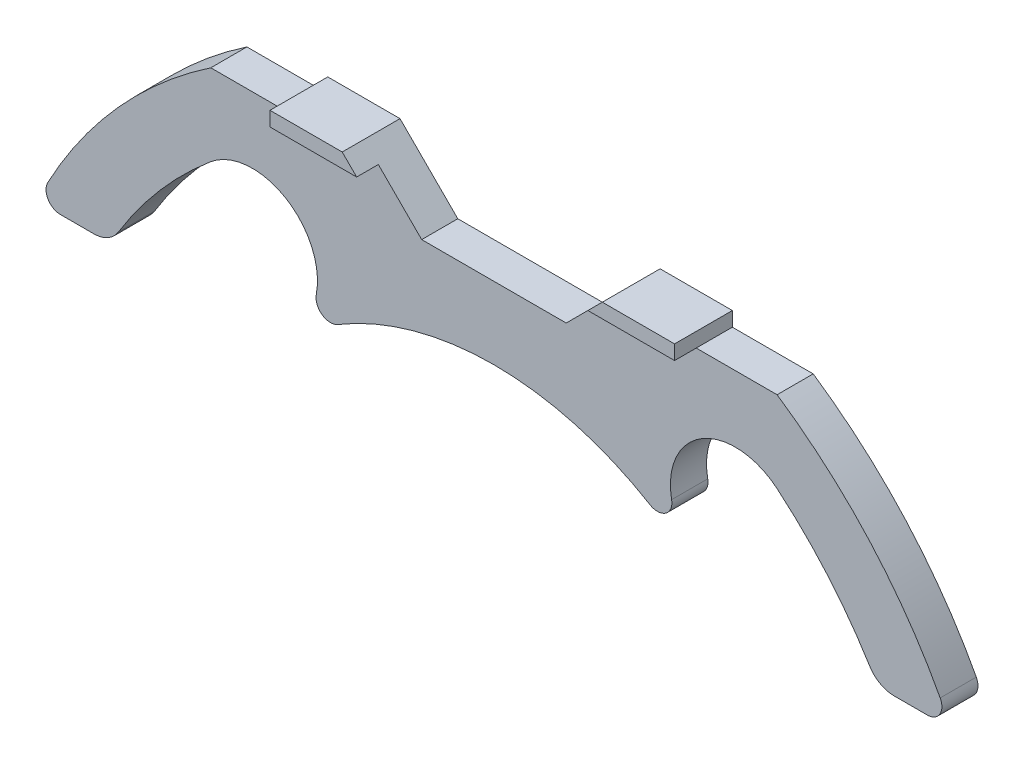
ISO-10303-21;
HEADER;
FILE_DESCRIPTION(('STEP AP214'),'2;1');
FILE_NAME('part.step','',(''),(''),'','','');
FILE_SCHEMA(('AUTOMOTIVE_DESIGN { 1 0 10303 214 1 1 1 1 }'));
ENDSEC;
DATA;
#1=APPLICATION_CONTEXT('core data for automotive mechanical design processes');
#2=APPLICATION_PROTOCOL_DEFINITION('international standard','automotive_design',2000,#1);
#3=PRODUCT_CONTEXT('',#1,'mechanical');
#4=PRODUCT('Part','Part','',(#3));
#5=PRODUCT_RELATED_PRODUCT_CATEGORY('part','',(#4));
#6=PRODUCT_DEFINITION_FORMATION('','',#4);
#7=PRODUCT_DEFINITION_CONTEXT('part definition',#1,'design');
#8=PRODUCT_DEFINITION('design','',#6,#7);
#9=PRODUCT_DEFINITION_SHAPE('','',#8);
#10=(LENGTH_UNIT() NAMED_UNIT(*) SI_UNIT(.MILLI.,.METRE.));
#11=(NAMED_UNIT(*) PLANE_ANGLE_UNIT() SI_UNIT($,.RADIAN.));
#12=(NAMED_UNIT(*) SI_UNIT($,.STERADIAN.) SOLID_ANGLE_UNIT());
#13=UNCERTAINTY_MEASURE_WITH_UNIT(LENGTH_MEASURE(1.E-05),#10,'distance_accuracy_value','');
#14=(GEOMETRIC_REPRESENTATION_CONTEXT(3) GLOBAL_UNCERTAINTY_ASSIGNED_CONTEXT((#13)) GLOBAL_UNIT_ASSIGNED_CONTEXT((#10,
#11,#12)) REPRESENTATION_CONTEXT('',''));
#15=CARTESIAN_POINT('',(0.,0.,0.));
#16=DIRECTION('',(0.,0.,1.));
#17=DIRECTION('',(1.,0.,0.));
#18=AXIS2_PLACEMENT_3D('',#15,#16,#17);
#19=CARTESIAN_POINT('',(0.,0.,1.25));
#20=DIRECTION('',(0.,0.,-1.));
#21=DIRECTION('',(-1.,0.,0.));
#22=AXIS2_PLACEMENT_3D('',#19,#20,#21);
#23=CYLINDRICAL_SURFACE('',#22,30.5);
#24=CARTESIAN_POINT('',(0.,0.,-1.25));
#25=DIRECTION('',(0.,0.,-1.));
#26=DIRECTION('',(1.,0.,0.));
#27=AXIS2_PLACEMENT_3D('',#24,#25,#26);
#28=CIRCLE('',#27,30.5);
#29=CARTESIAN_POINT('',(-25.994707016995,15.9538461538461,-1.25));
#30=VERTEX_POINT('',#29);
#31=CARTESIAN_POINT('',(-19.6050220954395,23.3643555151288,-1.25));
#32=VERTEX_POINT('',#31);
#33=EDGE_CURVE('E606',#30,#32,#28,.T.);
#34=ORIENTED_EDGE('',*,*,#33,.T.);
#35=DIRECTION('',(0.,0.,-1.));
#36=VECTOR('',#35,1.);
#37=CARTESIAN_POINT('',(-19.6050220954395,23.3643555151288,1.25));
#38=LINE('',#37,#36);
#39=CARTESIAN_POINT('',(-19.6050220954395,23.3643555151288,1.25));
#40=VERTEX_POINT('',#39);
#41=EDGE_CURVE('E11',#40,#32,#38,.T.);
#42=ORIENTED_EDGE('',*,*,#41,.F.);
#43=CARTESIAN_POINT('',(0.,0.,1.25));
#44=DIRECTION('',(0.,0.,-1.));
#45=DIRECTION('',(1.,0.,0.));
#46=AXIS2_PLACEMENT_3D('',#43,#44,#45);
#47=CIRCLE('',#46,30.5);
#48=CARTESIAN_POINT('',(-25.994707016995,15.9538461538461,1.25));
#49=VERTEX_POINT('',#48);
#50=EDGE_CURVE('E643',#49,#40,#47,.T.);
#51=ORIENTED_EDGE('',*,*,#50,.F.);
#52=DIRECTION('',(0.,0.,-1.));
#53=VECTOR('',#52,1.);
#54=CARTESIAN_POINT('',(-25.994707016995,15.9538461538461,1.25));
#55=LINE('',#54,#53);
#56=EDGE_CURVE('E684',#49,#30,#55,.T.);
#57=ORIENTED_EDGE('',*,*,#56,.T.);
#58=EDGE_LOOP('',(#34,#42,#51,#57));
#59=FACE_BOUND('',#58,.T.);
#60=ADVANCED_FACE('F350',(#59),#23,.F.);
#61=CARTESIAN_POINT('',(-16.7124778518501,19.9171555210934,1.25));
#62=DIRECTION('',(0.,0.,-1.));
#63=DIRECTION('',(-1.,0.,0.));
#64=AXIS2_PLACEMENT_3D('',#61,#62,#63);
#65=CYLINDRICAL_SURFACE('',#64,4.5);
#66=CARTESIAN_POINT('',(-16.7124778518501,19.9171555210934,-1.25));
#67=DIRECTION('',(0.,0.,-1.));
#68=DIRECTION('',(1.,0.,0.));
#69=AXIS2_PLACEMENT_3D('',#66,#67,#68);
#70=CIRCLE('',#69,4.5);
#71=CARTESIAN_POINT('',(-12.2950899704427,19.0588523664939,-1.25));
#72=VERTEX_POINT('',#71);
#73=EDGE_CURVE('E609',#32,#72,#70,.T.);
#74=ORIENTED_EDGE('',*,*,#73,.T.);
#75=DIRECTION('',(0.,0.,-1.));
#76=VECTOR('',#75,1.);
#77=CARTESIAN_POINT('',(-12.2950899704427,19.0588523664939,1.25));
#78=LINE('',#77,#76);
#79=CARTESIAN_POINT('',(-12.2950899704427,19.0588523664939,1.25));
#80=VERTEX_POINT('',#79);
#81=EDGE_CURVE('E357',#80,#72,#78,.T.);
#82=ORIENTED_EDGE('',*,*,#81,.F.);
#83=CARTESIAN_POINT('',(-16.7124778518501,19.9171555210934,1.25));
#84=DIRECTION('',(0.,0.,-1.));
#85=DIRECTION('',(1.,0.,0.));
#86=AXIS2_PLACEMENT_3D('',#83,#84,#85);
#87=CIRCLE('',#86,4.5);
#88=EDGE_CURVE('E646',#40,#80,#87,.T.);
#89=ORIENTED_EDGE('',*,*,#88,.F.);
#90=ORIENTED_EDGE('',*,*,#41,.T.);
#91=EDGE_LOOP('',(#74,#82,#89,#90));
#92=FACE_BOUND('',#91,.T.);
#93=ADVANCED_FACE('F755',(#92),#65,.F.);
#94=CARTESIAN_POINT('',(-11.3134482190188,18.8681183321385,1.25));
#95=DIRECTION('',(0.,0.,-1.));
#96=DIRECTION('',(-1.,0.,0.));
#97=AXIS2_PLACEMENT_3D('',#94,#95,#96);
#98=CYLINDRICAL_SURFACE('',#97,1.);
#99=CARTESIAN_POINT('',(-11.3134482190188,18.8681183321385,-1.25));
#100=DIRECTION('',(0.,0.,1.));
#101=DIRECTION('',(1.,0.,0.));
#102=AXIS2_PLACEMENT_3D('',#99,#100,#101);
#103=CIRCLE('',#102,1.);
#104=CARTESIAN_POINT('',(-10.7992005726998,18.0104765897685,-1.25));
#105=VERTEX_POINT('',#104);
#106=EDGE_CURVE('E611',#72,#105,#103,.T.);
#107=ORIENTED_EDGE('',*,*,#106,.T.);
#108=DIRECTION('',(0.,0.,-1.));
#109=VECTOR('',#108,1.);
#110=CARTESIAN_POINT('',(-10.7992005726998,18.0104765897685,1.25));
#111=LINE('',#110,#109);
#112=CARTESIAN_POINT('',(-10.7992005726998,18.0104765897685,1.25));
#113=VERTEX_POINT('',#112);
#114=EDGE_CURVE('E728',#113,#105,#111,.T.);
#115=ORIENTED_EDGE('',*,*,#114,.F.);
#116=CARTESIAN_POINT('',(-11.3134482190188,18.8681183321385,1.25));
#117=DIRECTION('',(0.,0.,1.));
#118=DIRECTION('',(1.,0.,0.));
#119=AXIS2_PLACEMENT_3D('',#116,#117,#118);
#120=CIRCLE('',#119,1.);
#121=EDGE_CURVE('E648',#80,#113,#120,.T.);
#122=ORIENTED_EDGE('',*,*,#121,.F.);
#123=ORIENTED_EDGE('',*,*,#81,.T.);
#124=EDGE_LOOP('',(#107,#115,#122,#123));
#125=FACE_BOUND('',#124,.T.);
#126=ADVANCED_FACE('F735',(#125),#98,.T.);
#127=CARTESIAN_POINT('',(0.,0.,1.25));
#128=DIRECTION('',(0.,0.,-1.));
#129=DIRECTION('',(-1.,0.,0.));
#130=AXIS2_PLACEMENT_3D('',#127,#128,#129);
#131=CYLINDRICAL_SURFACE('',#130,21.);
#132=CARTESIAN_POINT('',(0.,0.,-1.25));
#133=DIRECTION('',(0.,0.,-1.));
#134=DIRECTION('',(1.,0.,0.));
#135=AXIS2_PLACEMENT_3D('',#132,#133,#134);
#136=CIRCLE('',#135,21.);
#137=CARTESIAN_POINT('',(10.7992005726998,18.0104765897685,-1.25));
#138=VERTEX_POINT('',#137);
#139=EDGE_CURVE('E613',#105,#138,#136,.T.);
#140=ORIENTED_EDGE('',*,*,#139,.T.);
#141=DIRECTION('',(0.,0.,-1.));
#142=VECTOR('',#141,1.);
#143=CARTESIAN_POINT('',(10.7992005726998,18.0104765897685,1.25));
#144=LINE('',#143,#142);
#145=CARTESIAN_POINT('',(10.7992005726998,18.0104765897685,1.25));
#146=VERTEX_POINT('',#145);
#147=EDGE_CURVE('E725',#146,#138,#144,.T.);
#148=ORIENTED_EDGE('',*,*,#147,.F.);
#149=CARTESIAN_POINT('',(0.,0.,1.25));
#150=DIRECTION('',(0.,0.,-1.));
#151=DIRECTION('',(1.,0.,0.));
#152=AXIS2_PLACEMENT_3D('',#149,#150,#151);
#153=CIRCLE('',#152,21.);
#154=EDGE_CURVE('E650',#113,#146,#153,.T.);
#155=ORIENTED_EDGE('',*,*,#154,.F.);
#156=ORIENTED_EDGE('',*,*,#114,.T.);
#157=EDGE_LOOP('',(#140,#148,#155,#156));
#158=FACE_BOUND('',#157,.T.);
#159=ADVANCED_FACE('F743',(#158),#131,.F.);
#160=CARTESIAN_POINT('',(11.3134482190188,18.8681183321385,1.25));
#161=DIRECTION('',(0.,0.,-1.));
#162=DIRECTION('',(-1.,0.,0.));
#163=AXIS2_PLACEMENT_3D('',#160,#161,#162);
#164=CYLINDRICAL_SURFACE('',#163,1.);
#165=CARTESIAN_POINT('',(11.3134482190188,18.8681183321385,-1.25));
#166=DIRECTION('',(0.,0.,1.));
#167=DIRECTION('',(-1.,0.,0.));
#168=AXIS2_PLACEMENT_3D('',#165,#166,#167);
#169=CIRCLE('',#168,1.);
#170=CARTESIAN_POINT('',(12.2950899704427,19.0588523664939,-1.25));
#171=VERTEX_POINT('',#170);
#172=EDGE_CURVE('E615',#138,#171,#169,.T.);
#173=ORIENTED_EDGE('',*,*,#172,.T.);
#174=DIRECTION('',(0.,0.,-1.));
#175=VECTOR('',#174,1.);
#176=CARTESIAN_POINT('',(12.2950899704427,19.0588523664939,1.25));
#177=LINE('',#176,#175);
#178=CARTESIAN_POINT('',(12.2950899704427,19.0588523664939,1.25));
#179=VERTEX_POINT('',#178);
#180=EDGE_CURVE('E722',#179,#171,#177,.T.);
#181=ORIENTED_EDGE('',*,*,#180,.F.);
#182=CARTESIAN_POINT('',(11.3134482190188,18.8681183321385,1.25));
#183=DIRECTION('',(0.,0.,1.));
#184=DIRECTION('',(-1.,0.,0.));
#185=AXIS2_PLACEMENT_3D('',#182,#183,#184);
#186=CIRCLE('',#185,1.);
#187=EDGE_CURVE('E652',#146,#179,#186,.T.);
#188=ORIENTED_EDGE('',*,*,#187,.F.);
#189=ORIENTED_EDGE('',*,*,#147,.T.);
#190=EDGE_LOOP('',(#173,#181,#188,#189));
#191=FACE_BOUND('',#190,.T.);
#192=ADVANCED_FACE('F747',(#191),#164,.T.);
#193=CARTESIAN_POINT('',(16.7124778518501,19.9171555210934,1.25));
#194=DIRECTION('',(0.,0.,-1.));
#195=DIRECTION('',(-1.,0.,0.));
#196=AXIS2_PLACEMENT_3D('',#193,#194,#195);
#197=CYLINDRICAL_SURFACE('',#196,4.5);
#198=CARTESIAN_POINT('',(16.7124778518501,19.9171555210934,-1.25));
#199=DIRECTION('',(0.,0.,-1.));
#200=DIRECTION('',(-1.,0.,0.));
#201=AXIS2_PLACEMENT_3D('',#198,#199,#200);
#202=CIRCLE('',#201,4.5);
#203=CARTESIAN_POINT('',(19.6050220954395,23.3643555151288,-1.25));
#204=VERTEX_POINT('',#203);
#205=EDGE_CURVE('E617',#171,#204,#202,.T.);
#206=ORIENTED_EDGE('',*,*,#205,.T.);
#207=DIRECTION('',(0.,0.,-1.));
#208=VECTOR('',#207,1.);
#209=CARTESIAN_POINT('',(19.6050220954395,23.3643555151288,1.25));
#210=LINE('',#209,#208);
#211=CARTESIAN_POINT('',(19.6050220954395,23.3643555151288,1.25));
#212=VERTEX_POINT('',#211);
#213=EDGE_CURVE('E719',#212,#204,#210,.T.);
#214=ORIENTED_EDGE('',*,*,#213,.F.);
#215=CARTESIAN_POINT('',(16.7124778518501,19.9171555210934,1.25));
#216=DIRECTION('',(0.,0.,-1.));
#217=DIRECTION('',(-1.,0.,0.));
#218=AXIS2_PLACEMENT_3D('',#215,#216,#217);
#219=CIRCLE('',#218,4.5);
#220=EDGE_CURVE('E654',#179,#212,#219,.T.);
#221=ORIENTED_EDGE('',*,*,#220,.F.);
#222=ORIENTED_EDGE('',*,*,#180,.T.);
#223=EDGE_LOOP('',(#206,#214,#221,#222));
#224=FACE_BOUND('',#223,.T.);
#225=ADVANCED_FACE('F836',(#224),#197,.F.);
#226=CARTESIAN_POINT('',(0.,0.,1.25));
#227=DIRECTION('',(0.,0.,-1.));
#228=DIRECTION('',(-1.,0.,0.));
#229=AXIS2_PLACEMENT_3D('',#226,#227,#228);
#230=CYLINDRICAL_SURFACE('',#229,30.5);
#231=CARTESIAN_POINT('',(0.,0.,-1.25));
#232=DIRECTION('',(0.,0.,-1.));
#233=DIRECTION('',(-1.,0.,0.));
#234=AXIS2_PLACEMENT_3D('',#231,#232,#233);
#235=CIRCLE('',#234,30.5);
#236=CARTESIAN_POINT('',(25.994707016995,15.9538461538461,-1.25));
#237=VERTEX_POINT('',#236);
#238=EDGE_CURVE('E619',#204,#237,#235,.T.);
#239=ORIENTED_EDGE('',*,*,#238,.T.);
#240=DIRECTION('',(0.,0.,-1.));
#241=VECTOR('',#240,1.);
#242=CARTESIAN_POINT('',(25.994707016995,15.9538461538461,1.25));
#243=LINE('',#242,#241);
#244=CARTESIAN_POINT('',(25.994707016995,15.9538461538461,1.25));
#245=VERTEX_POINT('',#244);
#246=EDGE_CURVE('E716',#245,#237,#243,.T.);
#247=ORIENTED_EDGE('',*,*,#246,.F.);
#248=CARTESIAN_POINT('',(0.,0.,1.25));
#249=DIRECTION('',(0.,0.,-1.));
#250=DIRECTION('',(-1.,0.,0.));
#251=AXIS2_PLACEMENT_3D('',#248,#249,#250);
#252=CIRCLE('',#251,30.5);
#253=EDGE_CURVE('E656',#212,#245,#252,.T.);
#254=ORIENTED_EDGE('',*,*,#253,.F.);
#255=ORIENTED_EDGE('',*,*,#213,.T.);
#256=EDGE_LOOP('',(#239,#247,#254,#255));
#257=FACE_BOUND('',#256,.T.);
#258=ADVANCED_FACE('F839',(#257),#230,.F.);
#259=CARTESIAN_POINT('',(27.6992779689291,17.,1.25));
#260=DIRECTION('',(0.,0.,-1.));
#261=DIRECTION('',(-1.,0.,0.));
#262=AXIS2_PLACEMENT_3D('',#259,#260,#261);
#263=CYLINDRICAL_SURFACE('',#262,2.);
#264=CARTESIAN_POINT('',(27.6992779689291,17.,-1.25));
#265=DIRECTION('',(0.,0.,1.));
#266=DIRECTION('',(1.,0.,0.));
#267=AXIS2_PLACEMENT_3D('',#264,#265,#266);
#268=CIRCLE('',#267,2.);
#269=CARTESIAN_POINT('',(27.6992779689291,15.,-1.25));
#270=VERTEX_POINT('',#269);
#271=EDGE_CURVE('E621',#237,#270,#268,.T.);
#272=ORIENTED_EDGE('',*,*,#271,.T.);
#273=DIRECTION('',(0.,0.,-1.));
#274=VECTOR('',#273,1.);
#275=CARTESIAN_POINT('',(27.6992779689291,15.,1.25));
#276=LINE('',#275,#274);
#277=CARTESIAN_POINT('',(27.6992779689291,15.,1.25));
#278=VERTEX_POINT('',#277);
#279=EDGE_CURVE('E713',#278,#270,#276,.T.);
#280=ORIENTED_EDGE('',*,*,#279,.F.);
#281=CARTESIAN_POINT('',(27.6992779689291,17.,1.25));
#282=DIRECTION('',(0.,0.,1.));
#283=DIRECTION('',(1.,0.,0.));
#284=AXIS2_PLACEMENT_3D('',#281,#282,#283);
#285=CIRCLE('',#284,2.);
#286=EDGE_CURVE('E658',#245,#278,#285,.T.);
#287=ORIENTED_EDGE('',*,*,#286,.F.);
#288=ORIENTED_EDGE('',*,*,#246,.T.);
#289=EDGE_LOOP('',(#272,#280,#287,#288));
#290=FACE_BOUND('',#289,.T.);
#291=ADVANCED_FACE('F843',(#290),#263,.T.);
#292=CARTESIAN_POINT('',(30.,15.,1.25));
#293=DIRECTION('',(0.,1.,0.));
#294=DIRECTION('',(-1.,0.,0.));
#295=AXIS2_PLACEMENT_3D('',#292,#293,#294);
#296=PLANE('',#295);
#297=DIRECTION('',(1.,0.,0.));
#298=VECTOR('',#297,1.);
#299=CARTESIAN_POINT('',(30.,15.,-1.25));
#300=LINE('',#299,#298);
#301=CARTESIAN_POINT('',(30.,15.,-1.25));
#302=VERTEX_POINT('',#301);
#303=EDGE_CURVE('E623',#270,#302,#300,.T.);
#304=ORIENTED_EDGE('',*,*,#303,.T.);
#305=DIRECTION('',(0.,0.,-1.));
#306=VECTOR('',#305,1.);
#307=CARTESIAN_POINT('',(30.,15.,1.25));
#308=LINE('',#307,#306);
#309=CARTESIAN_POINT('',(30.,15.,1.25));
#310=VERTEX_POINT('',#309);
#311=EDGE_CURVE('E710',#310,#302,#308,.T.);
#312=ORIENTED_EDGE('',*,*,#311,.F.);
#313=DIRECTION('',(1.,0.,0.));
#314=VECTOR('',#313,1.);
#315=CARTESIAN_POINT('',(30.,15.,1.25));
#316=LINE('',#315,#314);
#317=EDGE_CURVE('E660',#278,#310,#316,.T.);
#318=ORIENTED_EDGE('',*,*,#317,.F.);
#319=ORIENTED_EDGE('',*,*,#279,.T.);
#320=EDGE_LOOP('',(#304,#312,#318,#319));
#321=FACE_BOUND('',#320,.T.);
#322=ADVANCED_FACE('F847',(#321),#296,.F.);
#323=CARTESIAN_POINT('',(30.,16.,1.25));
#324=DIRECTION('',(0.,0.,-1.));
#325=DIRECTION('',(-1.,0.,0.));
#326=AXIS2_PLACEMENT_3D('',#323,#324,#325);
#327=CYLINDRICAL_SURFACE('',#326,1.);
#328=CARTESIAN_POINT('',(30.,16.,-1.25));
#329=DIRECTION('',(0.,0.,1.));
#330=DIRECTION('',(-1.,0.,0.));
#331=AXIS2_PLACEMENT_3D('',#328,#329,#330);
#332=CIRCLE('',#331,1.);
#333=CARTESIAN_POINT('',(30.8823529411765,16.4705882352941,-1.25));
#334=VERTEX_POINT('',#333);
#335=EDGE_CURVE('E625',#302,#334,#332,.T.);
#336=ORIENTED_EDGE('',*,*,#335,.T.);
#337=DIRECTION('',(0.,0.,-1.));
#338=VECTOR('',#337,1.);
#339=CARTESIAN_POINT('',(30.8823529411765,16.4705882352941,1.25));
#340=LINE('',#339,#338);
#341=CARTESIAN_POINT('',(30.8823529411765,16.4705882352941,1.25));
#342=VERTEX_POINT('',#341);
#343=EDGE_CURVE('E707',#342,#334,#340,.T.);
#344=ORIENTED_EDGE('',*,*,#343,.F.);
#345=CARTESIAN_POINT('',(30.,16.,1.25));
#346=DIRECTION('',(0.,0.,1.));
#347=DIRECTION('',(-1.,0.,0.));
#348=AXIS2_PLACEMENT_3D('',#345,#346,#347);
#349=CIRCLE('',#348,1.);
#350=EDGE_CURVE('E662',#310,#342,#349,.T.);
#351=ORIENTED_EDGE('',*,*,#350,.F.);
#352=ORIENTED_EDGE('',*,*,#311,.T.);
#353=EDGE_LOOP('',(#336,#344,#351,#352));
#354=FACE_BOUND('',#353,.T.);
#355=ADVANCED_FACE('F851',(#354),#327,.T.);
#356=CARTESIAN_POINT('',(0.,0.,1.25));
#357=DIRECTION('',(0.,0.,-1.));
#358=DIRECTION('',(-1.,0.,0.));
#359=AXIS2_PLACEMENT_3D('',#356,#357,#358);
#360=CYLINDRICAL_SURFACE('',#359,35.);
#361=CARTESIAN_POINT('',(0.,0.,-1.25));
#362=DIRECTION('',(0.,0.,1.));
#363=DIRECTION('',(-1.,0.,0.));
#364=AXIS2_PLACEMENT_3D('',#361,#362,#363);
#365=CIRCLE('',#364,35.);
#366=CARTESIAN_POINT('',(19.5959179422654,29.,-1.25));
#367=VERTEX_POINT('',#366);
#368=EDGE_CURVE('E627',#334,#367,#365,.T.);
#369=ORIENTED_EDGE('',*,*,#368,.T.);
#370=DIRECTION('',(0.,0.,-1.));
#371=VECTOR('',#370,1.);
#372=CARTESIAN_POINT('',(19.5959179422654,29.,1.25));
#373=LINE('',#372,#371);
#374=CARTESIAN_POINT('',(19.5959179422654,29.,1.25));
#375=VERTEX_POINT('',#374);
#376=EDGE_CURVE('E704',#375,#367,#373,.T.);
#377=ORIENTED_EDGE('',*,*,#376,.F.);
#378=CARTESIAN_POINT('',(0.,0.,1.25));
#379=DIRECTION('',(0.,0.,1.));
#380=DIRECTION('',(-1.,0.,0.));
#381=AXIS2_PLACEMENT_3D('',#378,#379,#380);
#382=CIRCLE('',#381,35.);
#383=EDGE_CURVE('E664',#342,#375,#382,.T.);
#384=ORIENTED_EDGE('',*,*,#383,.F.);
#385=ORIENTED_EDGE('',*,*,#343,.T.);
#386=EDGE_LOOP('',(#369,#377,#384,#385));
#387=FACE_BOUND('',#386,.T.);
#388=ADVANCED_FACE('F855',(#387),#360,.T.);
#389=CARTESIAN_POINT('',(19.5959179422654,29.,1.25));
#390=DIRECTION('',(0.,-1.,0.));
#391=DIRECTION('',(1.,0.,0.));
#392=AXIS2_PLACEMENT_3D('',#389,#390,#391);
#393=PLANE('',#392);
#394=DIRECTION('',(-1.,0.,0.));
#395=VECTOR('',#394,1.);
#396=CARTESIAN_POINT('',(19.5959179422654,29.,-1.25));
#397=LINE('',#396,#395);
#398=CARTESIAN_POINT('',(14.,29.,-1.25));
#399=VERTEX_POINT('',#398);
#400=EDGE_CURVE('E629',#367,#399,#397,.T.);
#401=ORIENTED_EDGE('',*,*,#400,.T.);
#402=DIRECTION('',(0.,0.,-1.));
#403=VECTOR('',#402,1.);
#404=CARTESIAN_POINT('',(14.,29.,2.75));
#405=LINE('',#404,#403);
#406=CARTESIAN_POINT('',(14.,29.,1.25));
#407=VERTEX_POINT('',#406);
#408=EDGE_CURVE('E372',#407,#399,#405,.T.);
#409=ORIENTED_EDGE('',*,*,#408,.F.);
#410=DIRECTION('',(-1.,0.,0.));
#411=VECTOR('',#410,1.);
#412=CARTESIAN_POINT('',(19.5959179422654,29.,1.25));
#413=LINE('',#412,#411);
#414=EDGE_CURVE('E666',#375,#407,#413,.T.);
#415=ORIENTED_EDGE('',*,*,#414,.F.);
#416=ORIENTED_EDGE('',*,*,#376,.T.);
#417=EDGE_LOOP('',(#401,#409,#415,#416));
#418=FACE_BOUND('',#417,.T.);
#419=ADVANCED_FACE('F859',(#418),#393,.F.);
#420=CARTESIAN_POINT('',(4.99999999999998,26.,1.25));
#421=DIRECTION('',(0.707106781186546,-0.707106781186549,0.));
#422=DIRECTION('',(0.707106781186549,0.707106781186546,0.));
#423=AXIS2_PLACEMENT_3D('',#420,#421,#422);
#424=PLANE('',#423);
#425=DIRECTION('',(-0.707106781186549,-0.707106781186546,0.));
#426=VECTOR('',#425,1.);
#427=CARTESIAN_POINT('',(4.99999999999998,26.,-1.25));
#428=LINE('',#427,#426);
#429=CARTESIAN_POINT('',(8.99999999999999,30.,-1.25));
#430=VERTEX_POINT('',#429);
#431=CARTESIAN_POINT('',(4.99999999999998,26.,-1.25));
#432=VERTEX_POINT('',#431);
#433=EDGE_CURVE('E631',#430,#432,#428,.T.);
#434=ORIENTED_EDGE('',*,*,#433,.T.);
#435=DIRECTION('',(0.,0.,-1.));
#436=VECTOR('',#435,1.);
#437=CARTESIAN_POINT('',(4.99999999999998,26.,1.25));
#438=LINE('',#437,#436);
#439=CARTESIAN_POINT('',(4.99999999999998,26.,1.25));
#440=VERTEX_POINT('',#439);
#441=EDGE_CURVE('E701',#440,#432,#438,.T.);
#442=ORIENTED_EDGE('',*,*,#441,.F.);
#443=DIRECTION('',(-0.707106781186549,-0.707106781186546,0.));
#444=VECTOR('',#443,1.);
#445=CARTESIAN_POINT('',(4.99999999999998,26.,1.25));
#446=LINE('',#445,#444);
#447=CARTESIAN_POINT('',(8.,29.,1.25));
#448=VERTEX_POINT('',#447);
#449=EDGE_CURVE('E668',#448,#440,#446,.T.);
#450=ORIENTED_EDGE('',*,*,#449,.F.);
#451=DIRECTION('',(0.,0.,-1.));
#452=VECTOR('',#451,1.);
#453=CARTESIAN_POINT('',(7.99999999999999,29.,2.75));
#454=LINE('',#453,#452);
#455=CARTESIAN_POINT('',(7.99999999999999,29.,2.75));
#456=VERTEX_POINT('',#455);
#457=EDGE_CURVE('E598',#456,#448,#454,.T.);
#458=ORIENTED_EDGE('',*,*,#457,.F.);
#459=DIRECTION('',(0.707106781186547,0.707106781186547,0.));
#460=VECTOR('',#459,1.);
#461=CARTESIAN_POINT('',(7.99999999999999,29.,2.75));
#462=LINE('',#461,#460);
#463=CARTESIAN_POINT('',(8.99999999999999,30.,2.75));
#464=VERTEX_POINT('',#463);
#465=EDGE_CURVE('E586',#456,#464,#462,.T.);
#466=ORIENTED_EDGE('',*,*,#465,.T.);
#467=DIRECTION('',(0.,0.,-1.));
#468=VECTOR('',#467,1.);
#469=CARTESIAN_POINT('',(8.99999999999999,30.,2.75));
#470=LINE('',#469,#468);
#471=EDGE_CURVE('E595',#464,#430,#470,.T.);
#472=ORIENTED_EDGE('',*,*,#471,.T.);
#473=EDGE_LOOP('',(#434,#442,#450,#458,#466,#472));
#474=FACE_BOUND('',#473,.T.);
#475=ADVANCED_FACE('F798',(#474),#424,.F.);
#476=CARTESIAN_POINT('',(4.99999999999998,26.,1.25));
#477=DIRECTION('',(0.,-1.,0.));
#478=DIRECTION('',(0.,0.,-1.));
#479=AXIS2_PLACEMENT_3D('',#476,#477,#478);
#480=PLANE('',#479);
#481=DIRECTION('',(-1.,0.,0.));
#482=VECTOR('',#481,1.);
#483=CARTESIAN_POINT('',(4.99999999999998,26.,-1.25));
#484=LINE('',#483,#482);
#485=CARTESIAN_POINT('',(-4.99999999999998,26.,-1.25));
#486=VERTEX_POINT('',#485);
#487=EDGE_CURVE('E633',#432,#486,#484,.T.);
#488=ORIENTED_EDGE('',*,*,#487,.T.);
#489=DIRECTION('',(0.,0.,-1.));
#490=VECTOR('',#489,1.);
#491=CARTESIAN_POINT('',(-4.99999999999998,26.,1.25));
#492=LINE('',#491,#490);
#493=CARTESIAN_POINT('',(-4.99999999999998,26.,1.25));
#494=VERTEX_POINT('',#493);
#495=EDGE_CURVE('E698',#494,#486,#492,.T.);
#496=ORIENTED_EDGE('',*,*,#495,.F.);
#497=DIRECTION('',(-1.,0.,0.));
#498=VECTOR('',#497,1.);
#499=CARTESIAN_POINT('',(4.99999999999998,26.,1.25));
#500=LINE('',#499,#498);
#501=EDGE_CURVE('E670',#440,#494,#500,.T.);
#502=ORIENTED_EDGE('',*,*,#501,.F.);
#503=ORIENTED_EDGE('',*,*,#441,.T.);
#504=EDGE_LOOP('',(#488,#496,#502,#503));
#505=FACE_BOUND('',#504,.T.);
#506=ADVANCED_FACE('F794',(#505),#480,.F.);
#507=CARTESIAN_POINT('',(-4.99999999999998,26.,1.25));
#508=DIRECTION('',(-0.707106781186546,-0.707106781186549,0.));
#509=DIRECTION('',(0.707106781186549,-0.707106781186546,0.));
#510=AXIS2_PLACEMENT_3D('',#507,#508,#509);
#511=PLANE('',#510);
#512=DIRECTION('',(-0.707106781186549,0.707106781186546,0.));
#513=VECTOR('',#512,1.);
#514=CARTESIAN_POINT('',(-4.99999999999998,26.,-1.25));
#515=LINE('',#514,#513);
#516=CARTESIAN_POINT('',(-8.99999999999999,30.,-1.25));
#517=VERTEX_POINT('',#516);
#518=EDGE_CURVE('E539',#486,#517,#515,.T.);
#519=ORIENTED_EDGE('',*,*,#518,.T.);
#520=DIRECTION('',(0.,0.,-1.));
#521=VECTOR('',#520,1.);
#522=CARTESIAN_POINT('',(-8.99999999999999,30.,2.75));
#523=LINE('',#522,#521);
#524=CARTESIAN_POINT('',(-8.99999999999999,30.,2.75));
#525=VERTEX_POINT('',#524);
#526=EDGE_CURVE('E571',#525,#517,#523,.T.);
#527=ORIENTED_EDGE('',*,*,#526,.F.);
#528=DIRECTION('',(0.707106781186547,-0.707106781186547,0.));
#529=VECTOR('',#528,1.);
#530=CARTESIAN_POINT('',(-7.99999999999999,29.,2.75));
#531=LINE('',#530,#529);
#532=CARTESIAN_POINT('',(-7.99999999999999,29.,2.75));
#533=VERTEX_POINT('',#532);
#534=EDGE_CURVE('E547',#525,#533,#531,.T.);
#535=ORIENTED_EDGE('',*,*,#534,.T.);
#536=DIRECTION('',(0.,0.,-1.));
#537=VECTOR('',#536,1.);
#538=CARTESIAN_POINT('',(-7.99999999999999,29.,2.75));
#539=LINE('',#538,#537);
#540=CARTESIAN_POINT('',(-8.,29.,1.25));
#541=VERTEX_POINT('',#540);
#542=EDGE_CURVE('E567',#533,#541,#539,.T.);
#543=ORIENTED_EDGE('',*,*,#542,.T.);
#544=DIRECTION('',(-0.707106781186549,0.707106781186546,0.));
#545=VECTOR('',#544,1.);
#546=CARTESIAN_POINT('',(-4.99999999999998,26.,1.25));
#547=LINE('',#546,#545);
#548=EDGE_CURVE('E672',#494,#541,#547,.T.);
#549=ORIENTED_EDGE('',*,*,#548,.F.);
#550=ORIENTED_EDGE('',*,*,#495,.T.);
#551=EDGE_LOOP('',(#519,#527,#535,#543,#549,#550));
#552=FACE_BOUND('',#551,.T.);
#553=ADVANCED_FACE('F781',(#552),#511,.F.);
#554=CARTESIAN_POINT('',(-19.5959179422654,29.,1.25));
#555=DIRECTION('',(0.,-1.,0.));
#556=DIRECTION('',(1.,0.,0.));
#557=AXIS2_PLACEMENT_3D('',#554,#555,#556);
#558=PLANE('',#557);
#559=DIRECTION('',(-1.,0.,0.));
#560=VECTOR('',#559,1.);
#561=CARTESIAN_POINT('',(-19.5959179422654,29.,1.25));
#562=LINE('',#561,#560);
#563=CARTESIAN_POINT('',(-14.,29.,1.25));
#564=VERTEX_POINT('',#563);
#565=CARTESIAN_POINT('',(-19.5959179422654,29.,1.25));
#566=VERTEX_POINT('',#565);
#567=EDGE_CURVE('E364',#564,#566,#562,.T.);
#568=ORIENTED_EDGE('',*,*,#567,.F.);
#569=DIRECTION('',(0.,0.,-1.));
#570=VECTOR('',#569,1.);
#571=CARTESIAN_POINT('',(-14.,29.,2.75));
#572=LINE('',#571,#570);
#573=CARTESIAN_POINT('',(-14.,29.,-1.25));
#574=VERTEX_POINT('',#573);
#575=EDGE_CURVE('E542',#564,#574,#572,.T.);
#576=ORIENTED_EDGE('',*,*,#575,.T.);
#577=DIRECTION('',(-1.,0.,0.));
#578=VECTOR('',#577,1.);
#579=CARTESIAN_POINT('',(-19.5959179422654,29.,-1.25));
#580=LINE('',#579,#578);
#581=CARTESIAN_POINT('',(-19.5959179422654,29.,-1.25));
#582=VERTEX_POINT('',#581);
#583=EDGE_CURVE('E530',#574,#582,#580,.T.);
#584=ORIENTED_EDGE('',*,*,#583,.T.);
#585=DIRECTION('',(0.,0.,-1.));
#586=VECTOR('',#585,1.);
#587=CARTESIAN_POINT('',(-19.5959179422654,29.,1.25));
#588=LINE('',#587,#586);
#589=EDGE_CURVE('E696',#566,#582,#588,.T.);
#590=ORIENTED_EDGE('',*,*,#589,.F.);
#591=EDGE_LOOP('',(#568,#576,#584,#590));
#592=FACE_BOUND('',#591,.T.);
#593=ADVANCED_FACE('F543',(#592),#558,.F.);
#594=CARTESIAN_POINT('',(0.,0.,1.25));
#595=DIRECTION('',(0.,0.,-1.));
#596=DIRECTION('',(-1.,0.,0.));
#597=AXIS2_PLACEMENT_3D('',#594,#595,#596);
#598=CYLINDRICAL_SURFACE('',#597,35.);
#599=CARTESIAN_POINT('',(0.,0.,-1.25));
#600=DIRECTION('',(0.,0.,1.));
#601=DIRECTION('',(1.,0.,0.));
#602=AXIS2_PLACEMENT_3D('',#599,#600,#601);
#603=CIRCLE('',#602,35.);
#604=CARTESIAN_POINT('',(-30.8823529411765,16.4705882352941,-1.25));
#605=VERTEX_POINT('',#604);
#606=EDGE_CURVE('E537',#582,#605,#603,.T.);
#607=ORIENTED_EDGE('',*,*,#606,.T.);
#608=DIRECTION('',(0.,0.,-1.));
#609=VECTOR('',#608,1.);
#610=CARTESIAN_POINT('',(-30.8823529411765,16.4705882352941,1.25));
#611=LINE('',#610,#609);
#612=CARTESIAN_POINT('',(-30.8823529411765,16.4705882352941,1.25));
#613=VERTEX_POINT('',#612);
#614=EDGE_CURVE('E693',#613,#605,#611,.T.);
#615=ORIENTED_EDGE('',*,*,#614,.F.);
#616=CARTESIAN_POINT('',(0.,0.,1.25));
#617=DIRECTION('',(0.,0.,1.));
#618=DIRECTION('',(1.,0.,0.));
#619=AXIS2_PLACEMENT_3D('',#616,#617,#618);
#620=CIRCLE('',#619,35.);
#621=EDGE_CURVE('E676',#566,#613,#620,.T.);
#622=ORIENTED_EDGE('',*,*,#621,.F.);
#623=ORIENTED_EDGE('',*,*,#589,.T.);
#624=EDGE_LOOP('',(#607,#615,#622,#623));
#625=FACE_BOUND('',#624,.T.);
#626=ADVANCED_FACE('F774',(#625),#598,.T.);
#627=CARTESIAN_POINT('',(-30.,16.,1.25));
#628=DIRECTION('',(0.,0.,-1.));
#629=DIRECTION('',(-1.,0.,0.));
#630=AXIS2_PLACEMENT_3D('',#627,#628,#629);
#631=CYLINDRICAL_SURFACE('',#630,1.);
#632=CARTESIAN_POINT('',(-30.,16.,-1.25));
#633=DIRECTION('',(0.,0.,1.));
#634=DIRECTION('',(1.,0.,0.));
#635=AXIS2_PLACEMENT_3D('',#632,#633,#634);
#636=CIRCLE('',#635,1.);
#637=CARTESIAN_POINT('',(-30.,15.,-1.25));
#638=VERTEX_POINT('',#637);
#639=EDGE_CURVE('E637',#605,#638,#636,.T.);
#640=ORIENTED_EDGE('',*,*,#639,.T.);
#641=DIRECTION('',(0.,0.,-1.));
#642=VECTOR('',#641,1.);
#643=CARTESIAN_POINT('',(-30.,15.,1.25));
#644=LINE('',#643,#642);
#645=CARTESIAN_POINT('',(-30.,15.,1.25));
#646=VERTEX_POINT('',#645);
#647=EDGE_CURVE('E690',#646,#638,#644,.T.);
#648=ORIENTED_EDGE('',*,*,#647,.F.);
#649=CARTESIAN_POINT('',(-30.,16.,1.25));
#650=DIRECTION('',(0.,0.,1.));
#651=DIRECTION('',(1.,0.,0.));
#652=AXIS2_PLACEMENT_3D('',#649,#650,#651);
#653=CIRCLE('',#652,1.);
#654=EDGE_CURVE('E678',#613,#646,#653,.T.);
#655=ORIENTED_EDGE('',*,*,#654,.F.);
#656=ORIENTED_EDGE('',*,*,#614,.T.);
#657=EDGE_LOOP('',(#640,#648,#655,#656));
#658=FACE_BOUND('',#657,.T.);
#659=ADVANCED_FACE('F770',(#658),#631,.T.);
#660=CARTESIAN_POINT('',(-30.,15.,1.25));
#661=DIRECTION('',(0.,1.,0.));
#662=DIRECTION('',(-1.,0.,0.));
#663=AXIS2_PLACEMENT_3D('',#660,#661,#662);
#664=PLANE('',#663);
#665=DIRECTION('',(1.,0.,0.));
#666=VECTOR('',#665,1.);
#667=CARTESIAN_POINT('',(-30.,15.,-1.25));
#668=LINE('',#667,#666);
#669=CARTESIAN_POINT('',(-27.6992779689291,15.,-1.25));
#670=VERTEX_POINT('',#669);
#671=EDGE_CURVE('E639',#638,#670,#668,.T.);
#672=ORIENTED_EDGE('',*,*,#671,.T.);
#673=DIRECTION('',(0.,0.,-1.));
#674=VECTOR('',#673,1.);
#675=CARTESIAN_POINT('',(-27.6992779689291,15.,1.25));
#676=LINE('',#675,#674);
#677=CARTESIAN_POINT('',(-27.6992779689291,15.,1.25));
#678=VERTEX_POINT('',#677);
#679=EDGE_CURVE('E687',#678,#670,#676,.T.);
#680=ORIENTED_EDGE('',*,*,#679,.F.);
#681=DIRECTION('',(1.,0.,0.));
#682=VECTOR('',#681,1.);
#683=CARTESIAN_POINT('',(-30.,15.,1.25));
#684=LINE('',#683,#682);
#685=EDGE_CURVE('E680',#646,#678,#684,.T.);
#686=ORIENTED_EDGE('',*,*,#685,.F.);
#687=ORIENTED_EDGE('',*,*,#647,.T.);
#688=EDGE_LOOP('',(#672,#680,#686,#687));
#689=FACE_BOUND('',#688,.T.);
#690=ADVANCED_FACE('F766',(#689),#664,.F.);
#691=CARTESIAN_POINT('',(-27.6992779689291,17.,1.25));
#692=DIRECTION('',(0.,0.,-1.));
#693=DIRECTION('',(-1.,0.,0.));
#694=AXIS2_PLACEMENT_3D('',#691,#692,#693);
#695=CYLINDRICAL_SURFACE('',#694,2.);
#696=CARTESIAN_POINT('',(-27.6992779689291,17.,-1.25));
#697=DIRECTION('',(0.,0.,1.));
#698=DIRECTION('',(-1.,0.,0.));
#699=AXIS2_PLACEMENT_3D('',#696,#697,#698);
#700=CIRCLE('',#699,2.);
#701=EDGE_CURVE('E641',#670,#30,#700,.T.);
#702=ORIENTED_EDGE('',*,*,#701,.T.);
#703=ORIENTED_EDGE('',*,*,#56,.F.);
#704=CARTESIAN_POINT('',(-27.6992779689291,17.,1.25));
#705=DIRECTION('',(0.,0.,1.));
#706=DIRECTION('',(-1.,0.,0.));
#707=AXIS2_PLACEMENT_3D('',#704,#705,#706);
#708=CIRCLE('',#707,2.);
#709=EDGE_CURVE('E682',#678,#49,#708,.T.);
#710=ORIENTED_EDGE('',*,*,#709,.F.);
#711=ORIENTED_EDGE('',*,*,#679,.T.);
#712=EDGE_LOOP('',(#702,#703,#710,#711));
#713=FACE_BOUND('',#712,.T.);
#714=ADVANCED_FACE('F761',(#713),#695,.T.);
#715=CARTESIAN_POINT('',(0.,0.,1.25));
#716=DIRECTION('',(0.,0.,1.));
#717=DIRECTION('',(1.,0.,0.));
#718=AXIS2_PLACEMENT_3D('',#715,#716,#717);
#719=PLANE('',#718);
#720=ORIENTED_EDGE('',*,*,#50,.T.);
#721=ORIENTED_EDGE('',*,*,#88,.T.);
#722=ORIENTED_EDGE('',*,*,#121,.T.);
#723=ORIENTED_EDGE('',*,*,#154,.T.);
#724=ORIENTED_EDGE('',*,*,#187,.T.);
#725=ORIENTED_EDGE('',*,*,#220,.T.);
#726=ORIENTED_EDGE('',*,*,#253,.T.);
#727=ORIENTED_EDGE('',*,*,#286,.T.);
#728=ORIENTED_EDGE('',*,*,#317,.T.);
#729=ORIENTED_EDGE('',*,*,#350,.T.);
#730=ORIENTED_EDGE('',*,*,#383,.T.);
#731=ORIENTED_EDGE('',*,*,#414,.T.);
#732=DIRECTION('',(1.,0.,0.));
#733=VECTOR('',#732,1.);
#734=CARTESIAN_POINT('',(0.,29.,1.25));
#735=LINE('',#734,#733);
#736=EDGE_CURVE('E594',#448,#407,#735,.T.);
#737=ORIENTED_EDGE('',*,*,#736,.F.);
#738=ORIENTED_EDGE('',*,*,#449,.T.);
#739=ORIENTED_EDGE('',*,*,#501,.T.);
#740=ORIENTED_EDGE('',*,*,#548,.T.);
#741=EDGE_CURVE('E674',#541,#564,#562,.T.);
#742=ORIENTED_EDGE('',*,*,#741,.T.);
#743=ORIENTED_EDGE('',*,*,#567,.T.);
#744=ORIENTED_EDGE('',*,*,#621,.T.);
#745=ORIENTED_EDGE('',*,*,#654,.T.);
#746=ORIENTED_EDGE('',*,*,#685,.T.);
#747=ORIENTED_EDGE('',*,*,#709,.T.);
#748=EDGE_LOOP('',(#720,#721,#722,#723,#724,#725,#726,#727,#728,#729,#730,#731,#737,#738,#739,
#740,#742,#743,#744,#745,#746,#747));
#749=FACE_BOUND('',#748,.T.);
#750=ADVANCED_FACE('F751',(#749),#719,.T.);
#751=CARTESIAN_POINT('',(0.,0.,-1.25));
#752=DIRECTION('',(0.,0.,1.));
#753=DIRECTION('',(1.,0.,0.));
#754=AXIS2_PLACEMENT_3D('',#751,#752,#753);
#755=PLANE('',#754);
#756=ORIENTED_EDGE('',*,*,#33,.F.);
#757=ORIENTED_EDGE('',*,*,#701,.F.);
#758=ORIENTED_EDGE('',*,*,#671,.F.);
#759=ORIENTED_EDGE('',*,*,#639,.F.);
#760=ORIENTED_EDGE('',*,*,#606,.F.);
#761=ORIENTED_EDGE('',*,*,#583,.F.);
#762=DIRECTION('',(0.,1.,0.));
#763=VECTOR('',#762,1.);
#764=CARTESIAN_POINT('',(-14.,29.,-1.25));
#765=LINE('',#764,#763);
#766=CARTESIAN_POINT('',(-14.,30.,-1.25));
#767=VERTEX_POINT('',#766);
#768=EDGE_CURVE('E535',#574,#767,#765,.T.);
#769=ORIENTED_EDGE('',*,*,#768,.T.);
#770=DIRECTION('',(1.,0.,0.));
#771=VECTOR('',#770,1.);
#772=CARTESIAN_POINT('',(-8.99999999999999,30.,-1.25));
#773=LINE('',#772,#771);
#774=EDGE_CURVE('E553',#767,#517,#773,.T.);
#775=ORIENTED_EDGE('',*,*,#774,.T.);
#776=ORIENTED_EDGE('',*,*,#518,.F.);
#777=ORIENTED_EDGE('',*,*,#487,.F.);
#778=ORIENTED_EDGE('',*,*,#433,.F.);
#779=DIRECTION('',(1.,0.,0.));
#780=VECTOR('',#779,1.);
#781=CARTESIAN_POINT('',(8.99999999999999,30.,-1.25));
#782=LINE('',#781,#780);
#783=CARTESIAN_POINT('',(14.,30.,-1.25));
#784=VERTEX_POINT('',#783);
#785=EDGE_CURVE('E577',#430,#784,#782,.T.);
#786=ORIENTED_EDGE('',*,*,#785,.T.);
#787=DIRECTION('',(0.,-1.,0.));
#788=VECTOR('',#787,1.);
#789=CARTESIAN_POINT('',(14.,29.,-1.25));
#790=LINE('',#789,#788);
#791=EDGE_CURVE('E570',#784,#399,#790,.T.);
#792=ORIENTED_EDGE('',*,*,#791,.T.);
#793=ORIENTED_EDGE('',*,*,#400,.F.);
#794=ORIENTED_EDGE('',*,*,#368,.F.);
#795=ORIENTED_EDGE('',*,*,#335,.F.);
#796=ORIENTED_EDGE('',*,*,#303,.F.);
#797=ORIENTED_EDGE('',*,*,#271,.F.);
#798=ORIENTED_EDGE('',*,*,#238,.F.);
#799=ORIENTED_EDGE('',*,*,#205,.F.);
#800=ORIENTED_EDGE('',*,*,#172,.F.);
#801=ORIENTED_EDGE('',*,*,#139,.F.);
#802=ORIENTED_EDGE('',*,*,#106,.F.);
#803=ORIENTED_EDGE('',*,*,#73,.F.);
#804=EDGE_LOOP('',(#756,#757,#758,#759,#760,#761,#769,#775,#776,#777,#778,#786,#792,#793,#794,
#795,#796,#797,#798,#799,#800,#801,#802,#803));
#805=FACE_BOUND('',#804,.T.);
#806=ADVANCED_FACE('F532',(#805),#755,.F.);
#807=CARTESIAN_POINT('',(14.,29.,2.75));
#808=DIRECTION('',(1.,0.,0.));
#809=DIRECTION('',(0.,0.,-1.));
#810=AXIS2_PLACEMENT_3D('',#807,#808,#809);
#811=PLANE('',#810);
#812=ORIENTED_EDGE('',*,*,#791,.F.);
#813=DIRECTION('',(0.,0.,-1.));
#814=VECTOR('',#813,1.);
#815=CARTESIAN_POINT('',(14.,30.,2.75));
#816=LINE('',#815,#814);
#817=CARTESIAN_POINT('',(14.,30.,2.75));
#818=VERTEX_POINT('',#817);
#819=EDGE_CURVE('E592',#818,#784,#816,.T.);
#820=ORIENTED_EDGE('',*,*,#819,.F.);
#821=DIRECTION('',(0.,-1.,0.));
#822=VECTOR('',#821,1.);
#823=CARTESIAN_POINT('',(14.,29.,2.75));
#824=LINE('',#823,#822);
#825=CARTESIAN_POINT('',(14.,29.,2.75));
#826=VERTEX_POINT('',#825);
#827=EDGE_CURVE('E580',#818,#826,#824,.T.);
#828=ORIENTED_EDGE('',*,*,#827,.T.);
#829=EDGE_CURVE('E601',#826,#407,#405,.T.);
#830=ORIENTED_EDGE('',*,*,#829,.T.);
#831=ORIENTED_EDGE('',*,*,#408,.T.);
#832=EDGE_LOOP('',(#812,#820,#828,#830,#831));
#833=FACE_BOUND('',#832,.T.);
#834=ADVANCED_FACE('F807',(#833),#811,.T.);
#835=CARTESIAN_POINT('',(8.99999999999999,30.,2.75));
#836=DIRECTION('',(0.,1.,0.));
#837=DIRECTION('',(0.,0.,1.));
#838=AXIS2_PLACEMENT_3D('',#835,#836,#837);
#839=PLANE('',#838);
#840=ORIENTED_EDGE('',*,*,#785,.F.);
#841=ORIENTED_EDGE('',*,*,#471,.F.);
#842=DIRECTION('',(1.,0.,0.));
#843=VECTOR('',#842,1.);
#844=CARTESIAN_POINT('',(8.99999999999999,30.,2.75));
#845=LINE('',#844,#843);
#846=EDGE_CURVE('E589',#464,#818,#845,.T.);
#847=ORIENTED_EDGE('',*,*,#846,.T.);
#848=ORIENTED_EDGE('',*,*,#819,.T.);
#849=EDGE_LOOP('',(#840,#841,#847,#848));
#850=FACE_BOUND('',#849,.T.);
#851=ADVANCED_FACE('F803',(#850),#839,.T.);
#852=CARTESIAN_POINT('',(7.99999999999999,29.,2.75));
#853=DIRECTION('',(0.,-1.,0.));
#854=DIRECTION('',(0.,0.,-1.));
#855=AXIS2_PLACEMENT_3D('',#852,#853,#854);
#856=PLANE('',#855);
#857=ORIENTED_EDGE('',*,*,#457,.T.);
#858=ORIENTED_EDGE('',*,*,#736,.T.);
#859=ORIENTED_EDGE('',*,*,#829,.F.);
#860=DIRECTION('',(-1.,0.,0.));
#861=VECTOR('',#860,1.);
#862=CARTESIAN_POINT('',(7.99999999999999,29.,2.75));
#863=LINE('',#862,#861);
#864=EDGE_CURVE('E583',#826,#456,#863,.T.);
#865=ORIENTED_EDGE('',*,*,#864,.T.);
#866=EDGE_LOOP('',(#857,#858,#859,#865));
#867=FACE_BOUND('',#866,.T.);
#868=ADVANCED_FACE('F810',(#867),#856,.T.);
#869=CARTESIAN_POINT('',(14.,30.,2.75));
#870=DIRECTION('',(0.,0.,-1.));
#871=DIRECTION('',(-1.,0.,0.));
#872=AXIS2_PLACEMENT_3D('',#869,#870,#871);
#873=PLANE('',#872);
#874=ORIENTED_EDGE('',*,*,#827,.F.);
#875=ORIENTED_EDGE('',*,*,#846,.F.);
#876=ORIENTED_EDGE('',*,*,#465,.F.);
#877=ORIENTED_EDGE('',*,*,#864,.F.);
#878=EDGE_LOOP('',(#874,#875,#876,#877));
#879=FACE_BOUND('',#878,.T.);
#880=ADVANCED_FACE('F813',(#879),#873,.F.);
#881=CARTESIAN_POINT('',(-7.99999999999999,29.,2.75));
#882=DIRECTION('',(0.,-1.,0.));
#883=DIRECTION('',(0.,0.,-1.));
#884=AXIS2_PLACEMENT_3D('',#881,#882,#883);
#885=PLANE('',#884);
#886=CARTESIAN_POINT('',(-14.,29.,2.75));
#887=VERTEX_POINT('',#886);
#888=EDGE_CURVE('E546',#887,#564,#572,.T.);
#889=ORIENTED_EDGE('',*,*,#888,.T.);
#890=ORIENTED_EDGE('',*,*,#741,.F.);
#891=ORIENTED_EDGE('',*,*,#542,.F.);
#892=DIRECTION('',(-1.,0.,0.));
#893=VECTOR('',#892,1.);
#894=CARTESIAN_POINT('',(-7.99999999999999,29.,2.75));
#895=LINE('',#894,#893);
#896=EDGE_CURVE('E555',#533,#887,#895,.T.);
#897=ORIENTED_EDGE('',*,*,#896,.T.);
#898=EDGE_LOOP('',(#889,#890,#891,#897));
#899=FACE_BOUND('',#898,.T.);
#900=ADVANCED_FACE('F778',(#899),#885,.T.);
#901=CARTESIAN_POINT('',(-8.99999999999999,30.,2.75));
#902=DIRECTION('',(0.,1.,0.));
#903=DIRECTION('',(0.,0.,1.));
#904=AXIS2_PLACEMENT_3D('',#901,#902,#903);
#905=PLANE('',#904);
#906=ORIENTED_EDGE('',*,*,#774,.F.);
#907=DIRECTION('',(0.,0.,-1.));
#908=VECTOR('',#907,1.);
#909=CARTESIAN_POINT('',(-14.,30.,2.75));
#910=LINE('',#909,#908);
#911=CARTESIAN_POINT('',(-14.,30.,2.75));
#912=VERTEX_POINT('',#911);
#913=EDGE_CURVE('E551',#912,#767,#910,.T.);
#914=ORIENTED_EDGE('',*,*,#913,.F.);
#915=DIRECTION('',(1.,0.,0.));
#916=VECTOR('',#915,1.);
#917=CARTESIAN_POINT('',(-8.99999999999999,30.,2.75));
#918=LINE('',#917,#916);
#919=EDGE_CURVE('E562',#912,#525,#918,.T.);
#920=ORIENTED_EDGE('',*,*,#919,.T.);
#921=ORIENTED_EDGE('',*,*,#526,.T.);
#922=EDGE_LOOP('',(#906,#914,#920,#921));
#923=FACE_BOUND('',#922,.T.);
#924=ADVANCED_FACE('F788',(#923),#905,.T.);
#925=CARTESIAN_POINT('',(-14.,29.,2.75));
#926=DIRECTION('',(-1.,0.,0.));
#927=DIRECTION('',(0.,0.,1.));
#928=AXIS2_PLACEMENT_3D('',#925,#926,#927);
#929=PLANE('',#928);
#930=ORIENTED_EDGE('',*,*,#768,.F.);
#931=ORIENTED_EDGE('',*,*,#575,.F.);
#932=ORIENTED_EDGE('',*,*,#888,.F.);
#933=DIRECTION('',(0.,1.,0.));
#934=VECTOR('',#933,1.);
#935=CARTESIAN_POINT('',(-14.,29.,2.75));
#936=LINE('',#935,#934);
#937=EDGE_CURVE('E560',#887,#912,#936,.T.);
#938=ORIENTED_EDGE('',*,*,#937,.T.);
#939=ORIENTED_EDGE('',*,*,#913,.T.);
#940=EDGE_LOOP('',(#930,#931,#932,#938,#939));
#941=FACE_BOUND('',#940,.T.);
#942=ADVANCED_FACE('F549',(#941),#929,.T.);
#943=CARTESIAN_POINT('',(-14.,29.,2.75));
#944=DIRECTION('',(0.,0.,-1.));
#945=DIRECTION('',(-1.,0.,0.));
#946=AXIS2_PLACEMENT_3D('',#943,#944,#945);
#947=PLANE('',#946);
#948=ORIENTED_EDGE('',*,*,#896,.F.);
#949=ORIENTED_EDGE('',*,*,#534,.F.);
#950=ORIENTED_EDGE('',*,*,#919,.F.);
#951=ORIENTED_EDGE('',*,*,#937,.F.);
#952=EDGE_LOOP('',(#948,#949,#950,#951));
#953=FACE_BOUND('',#952,.T.);
#954=ADVANCED_FACE('F785',(#953),#947,.F.);
#955=CLOSED_SHELL('',(#60,#93,#126,#159,#192,#225,#258,#291,#322,#355,#388,#419,#475,#506,#553,
#593,#626,#659,#690,#714,#750,#806,#834,#851,#868,#880,#900,#924,#942,#954));
#956=MANIFOLD_SOLID_BREP('B2',#955);
#957=ADVANCED_BREP_SHAPE_REPRESENTATION('',(#18,#956),#14);
#958=SHAPE_DEFINITION_REPRESENTATION(#9,#957);
ENDSEC;
END-ISO-10303-21;
